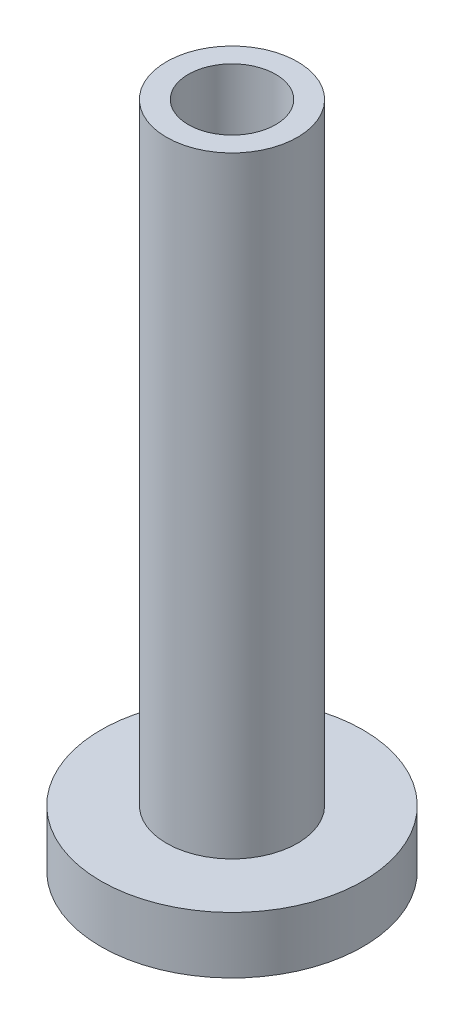
ISO-10303-21;
HEADER;
FILE_DESCRIPTION(('STEP AP214'),'2;1');
FILE_NAME('part.step','',(''),(''),'','','');
FILE_SCHEMA(('AUTOMOTIVE_DESIGN { 1 0 10303 214 1 1 1 1 }'));
ENDSEC;
DATA;
#1=APPLICATION_CONTEXT('core data for automotive mechanical design processes');
#2=APPLICATION_PROTOCOL_DEFINITION('international standard','automotive_design',2000,#1);
#3=PRODUCT_CONTEXT('',#1,'mechanical');
#4=PRODUCT('Part','Part','',(#3));
#5=PRODUCT_RELATED_PRODUCT_CATEGORY('part','',(#4));
#6=PRODUCT_DEFINITION_FORMATION('','',#4);
#7=PRODUCT_DEFINITION_CONTEXT('part definition',#1,'design');
#8=PRODUCT_DEFINITION('design','',#6,#7);
#9=PRODUCT_DEFINITION_SHAPE('','',#8);
#10=(LENGTH_UNIT() NAMED_UNIT(*) SI_UNIT(.MILLI.,.METRE.));
#11=(NAMED_UNIT(*) PLANE_ANGLE_UNIT() SI_UNIT($,.RADIAN.));
#12=(NAMED_UNIT(*) SI_UNIT($,.STERADIAN.) SOLID_ANGLE_UNIT());
#13=UNCERTAINTY_MEASURE_WITH_UNIT(LENGTH_MEASURE(1.E-05),#10,'distance_accuracy_value','');
#14=(GEOMETRIC_REPRESENTATION_CONTEXT(3) GLOBAL_UNCERTAINTY_ASSIGNED_CONTEXT((#13)) GLOBAL_UNIT_ASSIGNED_CONTEXT((#10,
#11,#12)) REPRESENTATION_CONTEXT('',''));
#15=CARTESIAN_POINT('',(0.,0.,0.));
#16=DIRECTION('',(0.,0.,1.));
#17=DIRECTION('',(1.,0.,0.));
#18=AXIS2_PLACEMENT_3D('',#15,#16,#17);
#19=CARTESIAN_POINT('',(0.,0.,0.));
#20=DIRECTION('',(0.,1.,0.));
#21=DIRECTION('',(0.,0.,1.));
#22=AXIS2_PLACEMENT_3D('',#19,#20,#21);
#23=PLANE('',#22);
#24=CARTESIAN_POINT('',(0.,0.,0.));
#25=DIRECTION('',(0.,1.,0.));
#26=DIRECTION('',(0.,0.,1.));
#27=AXIS2_PLACEMENT_3D('',#24,#25,#26);
#28=CIRCLE('',#27,3.);
#29=CARTESIAN_POINT('',(0.,0.,3.));
#30=VERTEX_POINT('',#29);
#31=EDGE_CURVE('E148',#30,#30,#28,.T.);
#32=ORIENTED_EDGE('',*,*,#31,.F.);
#33=EDGE_LOOP('',(#32));
#34=FACE_BOUND('',#33,.T.);
#35=DIRECTION('',(1.,0.,0.));
#36=VECTOR('',#35,1.);
#37=CARTESIAN_POINT('',(0.,0.,1.));
#38=LINE('',#37,#36);
#39=CARTESIAN_POINT('',(-0.577350269189626,0.,1.));
#40=VERTEX_POINT('',#39);
#41=CARTESIAN_POINT('',(0.577350269189626,0.,1.));
#42=VERTEX_POINT('',#41);
#43=EDGE_CURVE('E56',#40,#42,#38,.T.);
#44=ORIENTED_EDGE('',*,*,#43,.T.);
#45=DIRECTION('',(0.5,0.,-0.866025403784439));
#46=VECTOR('',#45,1.);
#47=CARTESIAN_POINT('',(0.866025403784439,0.,0.5));
#48=LINE('',#47,#46);
#49=CARTESIAN_POINT('',(1.15470053837925,0.,0.));
#50=VERTEX_POINT('',#49);
#51=EDGE_CURVE('E127',#42,#50,#48,.T.);
#52=ORIENTED_EDGE('',*,*,#51,.T.);
#53=DIRECTION('',(-0.5,0.,-0.866025403784438));
#54=VECTOR('',#53,1.);
#55=CARTESIAN_POINT('',(0.866025403784438,0.,-0.5));
#56=LINE('',#55,#54);
#57=CARTESIAN_POINT('',(0.577350269189626,0.,-1.));
#58=VERTEX_POINT('',#57);
#59=EDGE_CURVE('E131',#50,#58,#56,.T.);
#60=ORIENTED_EDGE('',*,*,#59,.T.);
#61=DIRECTION('',(-1.,0.,0.));
#62=VECTOR('',#61,1.);
#63=CARTESIAN_POINT('',(0.,0.,-1.));
#64=LINE('',#63,#62);
#65=CARTESIAN_POINT('',(-0.577350269189626,0.,-1.));
#66=VERTEX_POINT('',#65);
#67=EDGE_CURVE('E134',#58,#66,#64,.T.);
#68=ORIENTED_EDGE('',*,*,#67,.T.);
#69=DIRECTION('',(-0.5,0.,0.866025403784439));
#70=VECTOR('',#69,1.);
#71=CARTESIAN_POINT('',(-0.866025403784439,0.,-0.5));
#72=LINE('',#71,#70);
#73=CARTESIAN_POINT('',(-1.15470053837925,0.,0.));
#74=VERTEX_POINT('',#73);
#75=EDGE_CURVE('E117',#66,#74,#72,.T.);
#76=ORIENTED_EDGE('',*,*,#75,.T.);
#77=DIRECTION('',(0.5,0.,0.866025403784439));
#78=VECTOR('',#77,1.);
#79=CARTESIAN_POINT('',(-0.866025403784439,0.,0.5));
#80=LINE('',#79,#78);
#81=EDGE_CURVE('E137',#74,#40,#80,.T.);
#82=ORIENTED_EDGE('',*,*,#81,.T.);
#83=EDGE_LOOP('',(#44,#52,#60,#68,#76,#82));
#84=FACE_BOUND('',#83,.T.);
#85=ADVANCED_FACE('F41',(#34,#84),#23,.F.);
#86=CARTESIAN_POINT('',(0.,1.3,0.));
#87=DIRECTION('',(0.,-1.,0.));
#88=DIRECTION('',(0.,0.,-1.));
#89=AXIS2_PLACEMENT_3D('',#86,#87,#88);
#90=CYLINDRICAL_SURFACE('',#89,3.);
#91=CARTESIAN_POINT('',(0.,1.3,0.));
#92=DIRECTION('',(0.,1.,0.));
#93=DIRECTION('',(0.,0.,1.));
#94=AXIS2_PLACEMENT_3D('',#91,#92,#93);
#95=CIRCLE('',#94,3.);
#96=CARTESIAN_POINT('',(0.,1.3,3.));
#97=VERTEX_POINT('',#96);
#98=EDGE_CURVE('E49',#97,#97,#95,.T.);
#99=ORIENTED_EDGE('',*,*,#98,.F.);
#100=EDGE_LOOP('',(#99));
#101=FACE_BOUND('',#100,.T.);
#102=ORIENTED_EDGE('',*,*,#31,.T.);
#103=EDGE_LOOP('',(#102));
#104=FACE_BOUND('',#103,.T.);
#105=ADVANCED_FACE('F43',(#101,#104),#90,.T.);
#106=CARTESIAN_POINT('',(0.,1.3,0.));
#107=DIRECTION('',(0.,1.,0.));
#108=DIRECTION('',(0.,0.,1.));
#109=AXIS2_PLACEMENT_3D('',#106,#107,#108);
#110=PLANE('',#109);
#111=CARTESIAN_POINT('',(0.,1.3,0.));
#112=DIRECTION('',(0.,1.,0.));
#113=DIRECTION('',(0.,0.,1.));
#114=AXIS2_PLACEMENT_3D('',#111,#112,#113);
#115=CIRCLE('',#114,1.5);
#116=CARTESIAN_POINT('',(0.,1.3,1.5));
#117=VERTEX_POINT('',#116);
#118=EDGE_CURVE('E162',#117,#117,#115,.T.);
#119=ORIENTED_EDGE('',*,*,#118,.F.);
#120=EDGE_LOOP('',(#119));
#121=FACE_BOUND('',#120,.T.);
#122=ORIENTED_EDGE('',*,*,#98,.T.);
#123=EDGE_LOOP('',(#122));
#124=FACE_BOUND('',#123,.T.);
#125=ADVANCED_FACE('F177',(#121,#124),#110,.T.);
#126=CARTESIAN_POINT('',(0.,0.6,1.));
#127=DIRECTION('',(0.,0.,-1.));
#128=DIRECTION('',(-1.,0.,0.));
#129=AXIS2_PLACEMENT_3D('',#126,#127,#128);
#130=PLANE('',#129);
#131=ORIENTED_EDGE('',*,*,#43,.F.);
#132=DIRECTION('',(0.,-1.,0.));
#133=VECTOR('',#132,1.);
#134=CARTESIAN_POINT('',(-0.577350269189626,0.6,1.));
#135=LINE('',#134,#133);
#136=CARTESIAN_POINT('',(-0.577350269189626,0.6,1.));
#137=VERTEX_POINT('',#136);
#138=EDGE_CURVE('E122',#137,#40,#135,.T.);
#139=ORIENTED_EDGE('',*,*,#138,.F.);
#140=DIRECTION('',(1.,0.,0.));
#141=VECTOR('',#140,1.);
#142=CARTESIAN_POINT('',(0.,0.6,1.));
#143=LINE('',#142,#141);
#144=CARTESIAN_POINT('',(0.577350269189626,0.6,1.));
#145=VERTEX_POINT('',#144);
#146=EDGE_CURVE('E140',#137,#145,#143,.T.);
#147=ORIENTED_EDGE('',*,*,#146,.T.);
#148=DIRECTION('',(0.,-1.,0.));
#149=VECTOR('',#148,1.);
#150=CARTESIAN_POINT('',(0.577350269189626,0.6,1.));
#151=LINE('',#150,#149);
#152=EDGE_CURVE('E146',#145,#42,#151,.T.);
#153=ORIENTED_EDGE('',*,*,#152,.T.);
#154=EDGE_LOOP('',(#131,#139,#147,#153));
#155=FACE_BOUND('',#154,.T.);
#156=ADVANCED_FACE('F157',(#155),#130,.T.);
#157=CARTESIAN_POINT('',(0.866025403784439,0.6,0.5));
#158=DIRECTION('',(-0.866025403784439,0.,-0.5));
#159=DIRECTION('',(-0.5,0.,0.866025403784439));
#160=AXIS2_PLACEMENT_3D('',#157,#158,#159);
#161=PLANE('',#160);
#162=ORIENTED_EDGE('',*,*,#51,.F.);
#163=ORIENTED_EDGE('',*,*,#152,.F.);
#164=DIRECTION('',(0.5,0.,-0.866025403784439));
#165=VECTOR('',#164,1.);
#166=CARTESIAN_POINT('',(0.866025403784439,0.6,0.5));
#167=LINE('',#166,#165);
#168=CARTESIAN_POINT('',(1.15470053837925,0.6,0.));
#169=VERTEX_POINT('',#168);
#170=EDGE_CURVE('E95',#145,#169,#167,.T.);
#171=ORIENTED_EDGE('',*,*,#170,.T.);
#172=DIRECTION('',(0.,-1.,0.));
#173=VECTOR('',#172,1.);
#174=CARTESIAN_POINT('',(1.15470053837925,0.6,0.));
#175=LINE('',#174,#173);
#176=EDGE_CURVE('E144',#169,#50,#175,.T.);
#177=ORIENTED_EDGE('',*,*,#176,.T.);
#178=EDGE_LOOP('',(#162,#163,#171,#177));
#179=FACE_BOUND('',#178,.T.);
#180=ADVANCED_FACE('F169',(#179),#161,.T.);
#181=CARTESIAN_POINT('',(0.866025403784438,0.6,-0.5));
#182=DIRECTION('',(-0.866025403784438,0.,0.5));
#183=DIRECTION('',(0.5,0.,0.866025403784439));
#184=AXIS2_PLACEMENT_3D('',#181,#182,#183);
#185=PLANE('',#184);
#186=ORIENTED_EDGE('',*,*,#59,.F.);
#187=ORIENTED_EDGE('',*,*,#176,.F.);
#188=DIRECTION('',(-0.5,0.,-0.866025403784438));
#189=VECTOR('',#188,1.);
#190=CARTESIAN_POINT('',(0.866025403784438,0.6,-0.5));
#191=LINE('',#190,#189);
#192=CARTESIAN_POINT('',(0.577350269189626,0.6,-1.));
#193=VERTEX_POINT('',#192);
#194=EDGE_CURVE('E113',#169,#193,#191,.T.);
#195=ORIENTED_EDGE('',*,*,#194,.T.);
#196=DIRECTION('',(0.,-1.,0.));
#197=VECTOR('',#196,1.);
#198=CARTESIAN_POINT('',(0.577350269189626,0.6,-1.));
#199=LINE('',#198,#197);
#200=EDGE_CURVE('E110',#193,#58,#199,.T.);
#201=ORIENTED_EDGE('',*,*,#200,.T.);
#202=EDGE_LOOP('',(#186,#187,#195,#201));
#203=FACE_BOUND('',#202,.T.);
#204=ADVANCED_FACE('F167',(#203),#185,.T.);
#205=CARTESIAN_POINT('',(0.,0.6,-1.));
#206=DIRECTION('',(0.,0.,1.));
#207=DIRECTION('',(1.,0.,0.));
#208=AXIS2_PLACEMENT_3D('',#205,#206,#207);
#209=PLANE('',#208);
#210=ORIENTED_EDGE('',*,*,#67,.F.);
#211=ORIENTED_EDGE('',*,*,#200,.F.);
#212=DIRECTION('',(-1.,0.,0.));
#213=VECTOR('',#212,1.);
#214=CARTESIAN_POINT('',(0.,0.6,-1.));
#215=LINE('',#214,#213);
#216=CARTESIAN_POINT('',(-0.577350269189626,0.6,-1.));
#217=VERTEX_POINT('',#216);
#218=EDGE_CURVE('E105',#193,#217,#215,.T.);
#219=ORIENTED_EDGE('',*,*,#218,.T.);
#220=DIRECTION('',(0.,-1.,0.));
#221=VECTOR('',#220,1.);
#222=CARTESIAN_POINT('',(-0.577350269189626,0.6,-1.));
#223=LINE('',#222,#221);
#224=EDGE_CURVE('E109',#217,#66,#223,.T.);
#225=ORIENTED_EDGE('',*,*,#224,.T.);
#226=EDGE_LOOP('',(#210,#211,#219,#225));
#227=FACE_BOUND('',#226,.T.);
#228=ADVANCED_FACE('F108',(#227),#209,.T.);
#229=CARTESIAN_POINT('',(-0.866025403784439,0.6,-0.5));
#230=DIRECTION('',(0.866025403784439,0.,0.5));
#231=DIRECTION('',(0.5,0.,-0.866025403784439));
#232=AXIS2_PLACEMENT_3D('',#229,#230,#231);
#233=PLANE('',#232);
#234=ORIENTED_EDGE('',*,*,#75,.F.);
#235=ORIENTED_EDGE('',*,*,#224,.F.);
#236=DIRECTION('',(-0.5,0.,0.866025403784439));
#237=VECTOR('',#236,1.);
#238=CARTESIAN_POINT('',(-0.866025403784439,0.6,-0.5));
#239=LINE('',#238,#237);
#240=CARTESIAN_POINT('',(-1.15470053837925,0.6,0.));
#241=VERTEX_POINT('',#240);
#242=EDGE_CURVE('E112',#217,#241,#239,.T.);
#243=ORIENTED_EDGE('',*,*,#242,.T.);
#244=DIRECTION('',(0.,-1.,0.));
#245=VECTOR('',#244,1.);
#246=CARTESIAN_POINT('',(-1.15470053837925,0.6,0.));
#247=LINE('',#246,#245);
#248=EDGE_CURVE('E86',#241,#74,#247,.T.);
#249=ORIENTED_EDGE('',*,*,#248,.T.);
#250=EDGE_LOOP('',(#234,#235,#243,#249));
#251=FACE_BOUND('',#250,.T.);
#252=ADVANCED_FACE('F115',(#251),#233,.T.);
#253=CARTESIAN_POINT('',(-0.866025403784439,0.6,0.5));
#254=DIRECTION('',(0.866025403784438,0.,-0.5));
#255=DIRECTION('',(-0.5,0.,-0.866025403784439));
#256=AXIS2_PLACEMENT_3D('',#253,#254,#255);
#257=PLANE('',#256);
#258=ORIENTED_EDGE('',*,*,#81,.F.);
#259=ORIENTED_EDGE('',*,*,#248,.F.);
#260=DIRECTION('',(0.5,0.,0.866025403784439));
#261=VECTOR('',#260,1.);
#262=CARTESIAN_POINT('',(-0.866025403784439,0.6,0.5));
#263=LINE('',#262,#261);
#264=EDGE_CURVE('E64',#241,#137,#263,.T.);
#265=ORIENTED_EDGE('',*,*,#264,.T.);
#266=ORIENTED_EDGE('',*,*,#138,.T.);
#267=EDGE_LOOP('',(#258,#259,#265,#266));
#268=FACE_BOUND('',#267,.T.);
#269=ADVANCED_FACE('F156',(#268),#257,.T.);
#270=CARTESIAN_POINT('',(0.,0.6,0.));
#271=DIRECTION('',(0.,1.,0.));
#272=DIRECTION('',(0.,0.,1.));
#273=AXIS2_PLACEMENT_3D('',#270,#271,#272);
#274=PLANE('',#273);
#275=ORIENTED_EDGE('',*,*,#146,.F.);
#276=ORIENTED_EDGE('',*,*,#264,.F.);
#277=ORIENTED_EDGE('',*,*,#242,.F.);
#278=ORIENTED_EDGE('',*,*,#218,.F.);
#279=ORIENTED_EDGE('',*,*,#194,.F.);
#280=ORIENTED_EDGE('',*,*,#170,.F.);
#281=EDGE_LOOP('',(#275,#276,#277,#278,#279,#280));
#282=FACE_BOUND('',#281,.T.);
#283=ADVANCED_FACE('F120',(#282),#274,.F.);
#284=CARTESIAN_POINT('',(0.,15.3,0.));
#285=DIRECTION('',(0.,1.,0.));
#286=DIRECTION('',(0.,0.,1.));
#287=AXIS2_PLACEMENT_3D('',#284,#285,#286);
#288=PLANE('',#287);
#289=CARTESIAN_POINT('',(0.,15.3,0.));
#290=DIRECTION('',(0.,1.,0.));
#291=DIRECTION('',(0.,0.,1.));
#292=AXIS2_PLACEMENT_3D('',#289,#290,#291);
#293=CIRCLE('',#292,1.5);
#294=CARTESIAN_POINT('',(0.,15.3,1.5));
#295=VERTEX_POINT('',#294);
#296=EDGE_CURVE('E128',#295,#295,#293,.T.);
#297=ORIENTED_EDGE('',*,*,#296,.T.);
#298=EDGE_LOOP('',(#297));
#299=FACE_BOUND('',#298,.T.);
#300=CARTESIAN_POINT('',(0.,15.3,0.));
#301=DIRECTION('',(0.,1.,0.));
#302=DIRECTION('',(0.,0.,1.));
#303=AXIS2_PLACEMENT_3D('',#300,#301,#302);
#304=CIRCLE('',#303,1.);
#305=CARTESIAN_POINT('',(0.,15.3,1.));
#306=VERTEX_POINT('',#305);
#307=EDGE_CURVE('E270',#306,#306,#304,.T.);
#308=ORIENTED_EDGE('',*,*,#307,.F.);
#309=EDGE_LOOP('',(#308));
#310=FACE_BOUND('',#309,.T.);
#311=ADVANCED_FACE('F206',(#299,#310),#288,.T.);
#312=CARTESIAN_POINT('',(0.,15.3,0.));
#313=DIRECTION('',(0.,-1.,0.));
#314=DIRECTION('',(0.,0.,-1.));
#315=AXIS2_PLACEMENT_3D('',#312,#313,#314);
#316=CYLINDRICAL_SURFACE('',#315,1.5);
#317=ORIENTED_EDGE('',*,*,#296,.F.);
#318=EDGE_LOOP('',(#317));
#319=FACE_BOUND('',#318,.T.);
#320=ORIENTED_EDGE('',*,*,#118,.T.);
#321=EDGE_LOOP('',(#320));
#322=FACE_BOUND('',#321,.T.);
#323=ADVANCED_FACE('F198',(#319,#322),#316,.T.);
#324=CARTESIAN_POINT('',(0.,15.3,0.));
#325=DIRECTION('',(0.,-1.,0.));
#326=DIRECTION('',(0.,0.,-1.));
#327=AXIS2_PLACEMENT_3D('',#324,#325,#326);
#328=CYLINDRICAL_SURFACE('',#327,1.);
#329=ORIENTED_EDGE('',*,*,#307,.T.);
#330=EDGE_LOOP('',(#329));
#331=FACE_BOUND('',#330,.T.);
#332=CARTESIAN_POINT('',(0.,1.3,0.));
#333=DIRECTION('',(0.,1.,0.));
#334=DIRECTION('',(0.,0.,1.));
#335=AXIS2_PLACEMENT_3D('',#332,#333,#334);
#336=CIRCLE('',#335,1.);
#337=CARTESIAN_POINT('',(0.,1.3,1.));
#338=VERTEX_POINT('',#337);
#339=EDGE_CURVE('E11',#338,#338,#336,.F.);
#340=ORIENTED_EDGE('',*,*,#339,.T.);
#341=EDGE_LOOP('',(#340));
#342=FACE_BOUND('',#341,.T.);
#343=ADVANCED_FACE('F193',(#331,#342),#328,.F.);
#344=ORIENTED_EDGE('',*,*,#339,.F.);
#345=EDGE_LOOP('',(#344));
#346=FACE_BOUND('',#345,.T.);
#347=ADVANCED_FACE('F183',(#346),#110,.T.);
#348=CLOSED_SHELL('',(#85,#105,#125,#156,#180,#204,#228,#252,#269,#283,#311,#323,#343,#347));
#349=MANIFOLD_SOLID_BREP('B2',#348);
#350=ADVANCED_BREP_SHAPE_REPRESENTATION('',(#18,#349),#14);
#351=SHAPE_DEFINITION_REPRESENTATION(#9,#350);
ENDSEC;
END-ISO-10303-21;
